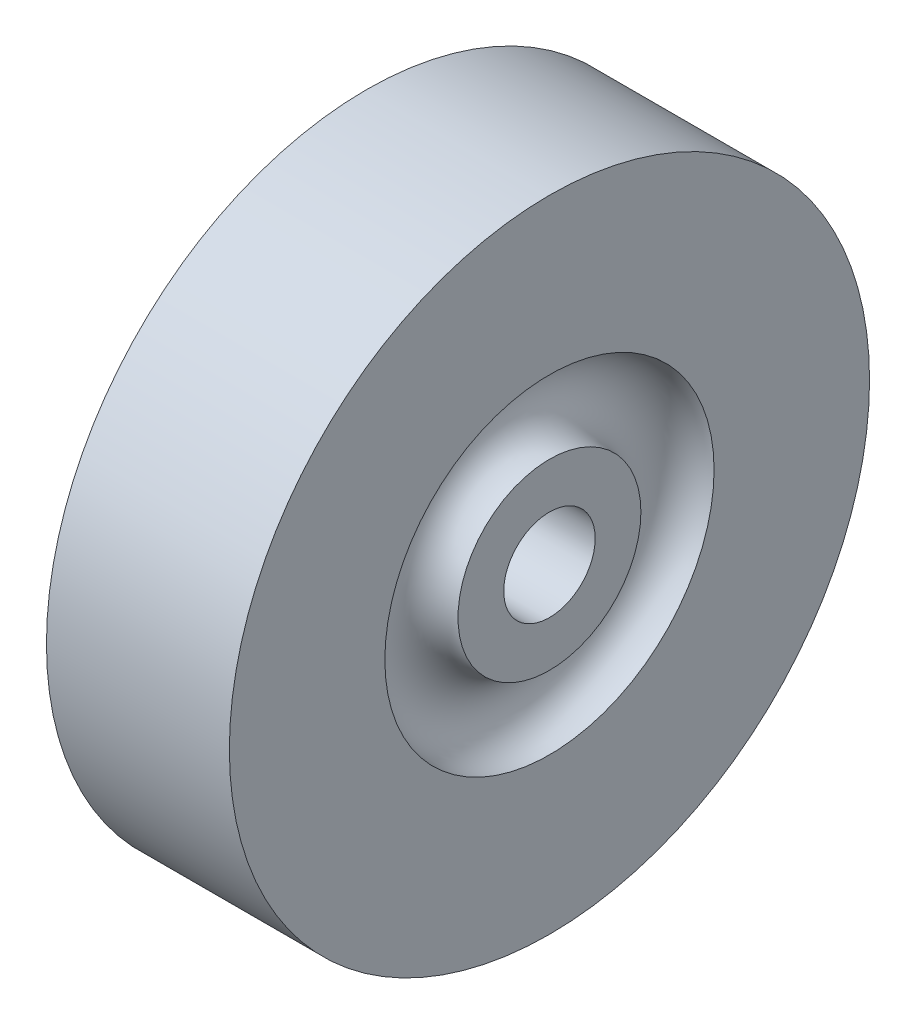
ISO-10303-21;
HEADER;
FILE_DESCRIPTION(('STEP AP214'),'2;1');
FILE_NAME('part.step','',(''),(''),'','','');
FILE_SCHEMA(('AUTOMOTIVE_DESIGN { 1 0 10303 214 1 1 1 1 }'));
ENDSEC;
DATA;
#1=APPLICATION_CONTEXT('core data for automotive mechanical design processes');
#2=APPLICATION_PROTOCOL_DEFINITION('international standard','automotive_design',2000,#1);
#3=PRODUCT_CONTEXT('',#1,'mechanical');
#4=PRODUCT('Part','Part','',(#3));
#5=PRODUCT_RELATED_PRODUCT_CATEGORY('part','',(#4));
#6=PRODUCT_DEFINITION_FORMATION('','',#4);
#7=PRODUCT_DEFINITION_CONTEXT('part definition',#1,'design');
#8=PRODUCT_DEFINITION('design','',#6,#7);
#9=PRODUCT_DEFINITION_SHAPE('','',#8);
#10=(LENGTH_UNIT() NAMED_UNIT(*) SI_UNIT(.MILLI.,.METRE.));
#11=(NAMED_UNIT(*) PLANE_ANGLE_UNIT() SI_UNIT($,.RADIAN.));
#12=(NAMED_UNIT(*) SI_UNIT($,.STERADIAN.) SOLID_ANGLE_UNIT());
#13=UNCERTAINTY_MEASURE_WITH_UNIT(LENGTH_MEASURE(1.E-05),#10,'distance_accuracy_value','');
#14=(GEOMETRIC_REPRESENTATION_CONTEXT(3) GLOBAL_UNCERTAINTY_ASSIGNED_CONTEXT((#13)) GLOBAL_UNIT_ASSIGNED_CONTEXT((#10,
#11,#12)) REPRESENTATION_CONTEXT('',''));
#15=CARTESIAN_POINT('',(0.,0.,0.));
#16=DIRECTION('',(0.,0.,1.));
#17=DIRECTION('',(1.,0.,0.));
#18=AXIS2_PLACEMENT_3D('',#15,#16,#17);
#19=CARTESIAN_POINT('',(12.7,0.,0.));
#20=DIRECTION('',(1.,0.,0.));
#21=DIRECTION('',(0.,0.,-1.));
#22=AXIS2_PLACEMENT_3D('',#19,#20,#21);
#23=TOROIDAL_SURFACE('',#22,17.78,5.08);
#24=CARTESIAN_POINT('',(12.7,0.,0.));
#25=DIRECTION('',(1.,0.,0.));
#26=DIRECTION('',(0.,0.,-1.));
#27=AXIS2_PLACEMENT_3D('',#24,#25,#26);
#28=CIRCLE('',#27,22.86);
#29=CARTESIAN_POINT('',(12.7,0.,-22.86));
#30=VERTEX_POINT('',#29);
#31=EDGE_CURVE('E62',#30,#30,#28,.T.);
#32=ORIENTED_EDGE('',*,*,#31,.T.);
#33=EDGE_LOOP('',(#32));
#34=FACE_BOUND('',#33,.T.);
#35=CARTESIAN_POINT('',(12.7,0.,0.));
#36=DIRECTION('',(1.,0.,0.));
#37=DIRECTION('',(0.,0.,-1.));
#38=AXIS2_PLACEMENT_3D('',#35,#36,#37);
#39=CIRCLE('',#38,12.7);
#40=CARTESIAN_POINT('',(12.7,0.,-12.7));
#41=VERTEX_POINT('',#40);
#42=EDGE_CURVE('E10',#41,#41,#39,.T.);
#43=ORIENTED_EDGE('',*,*,#42,.F.);
#44=EDGE_LOOP('',(#43));
#45=FACE_BOUND('',#44,.T.);
#46=ADVANCED_FACE('F34',(#34,#45),#23,.F.);
#47=CARTESIAN_POINT('',(12.7,6.35,0.));
#48=DIRECTION('',(1.,0.,0.));
#49=DIRECTION('',(0.,0.,-1.));
#50=AXIS2_PLACEMENT_3D('',#47,#48,#49);
#51=PLANE('',#50);
#52=ORIENTED_EDGE('',*,*,#42,.T.);
#53=EDGE_LOOP('',(#52));
#54=FACE_BOUND('',#53,.T.);
#55=CARTESIAN_POINT('',(12.7,0.,0.));
#56=DIRECTION('',(1.,0.,0.));
#57=DIRECTION('',(0.,0.,-1.));
#58=AXIS2_PLACEMENT_3D('',#55,#56,#57);
#59=CIRCLE('',#58,6.35);
#60=CARTESIAN_POINT('',(12.7,0.,-6.35));
#61=VERTEX_POINT('',#60);
#62=EDGE_CURVE('E40',#61,#61,#59,.T.);
#63=ORIENTED_EDGE('',*,*,#62,.F.);
#64=EDGE_LOOP('',(#63));
#65=FACE_BOUND('',#64,.T.);
#66=ADVANCED_FACE('F80',(#54,#65),#51,.T.);
#67=CARTESIAN_POINT('',(12.7,0.,0.));
#68=DIRECTION('',(1.,0.,0.));
#69=DIRECTION('',(0.,0.,-1.));
#70=AXIS2_PLACEMENT_3D('',#67,#68,#69);
#71=CYLINDRICAL_SURFACE('',#70,6.35);
#72=ORIENTED_EDGE('',*,*,#62,.T.);
#73=EDGE_LOOP('',(#72));
#74=FACE_BOUND('',#73,.T.);
#75=CARTESIAN_POINT('',(-12.7,0.,0.));
#76=DIRECTION('',(1.,0.,0.));
#77=DIRECTION('',(0.,0.,-1.));
#78=AXIS2_PLACEMENT_3D('',#75,#76,#77);
#79=CIRCLE('',#78,6.35);
#80=CARTESIAN_POINT('',(-12.7,0.,-6.35));
#81=VERTEX_POINT('',#80);
#82=EDGE_CURVE('E44',#81,#81,#79,.T.);
#83=ORIENTED_EDGE('',*,*,#82,.F.);
#84=EDGE_LOOP('',(#83));
#85=FACE_BOUND('',#84,.T.);
#86=ADVANCED_FACE('F84',(#74,#85),#71,.F.);
#87=CARTESIAN_POINT('',(-12.7,6.35,0.));
#88=DIRECTION('',(-1.,0.,0.));
#89=DIRECTION('',(0.,0.,1.));
#90=AXIS2_PLACEMENT_3D('',#87,#88,#89);
#91=PLANE('',#90);
#92=ORIENTED_EDGE('',*,*,#82,.T.);
#93=EDGE_LOOP('',(#92));
#94=FACE_BOUND('',#93,.T.);
#95=CARTESIAN_POINT('',(-12.7,0.,0.));
#96=DIRECTION('',(1.,0.,0.));
#97=DIRECTION('',(0.,0.,-1.));
#98=AXIS2_PLACEMENT_3D('',#95,#96,#97);
#99=CIRCLE('',#98,12.7);
#100=CARTESIAN_POINT('',(-12.7,0.,-12.7));
#101=VERTEX_POINT('',#100);
#102=EDGE_CURVE('E48',#101,#101,#99,.T.);
#103=ORIENTED_EDGE('',*,*,#102,.F.);
#104=EDGE_LOOP('',(#103));
#105=FACE_BOUND('',#104,.T.);
#106=ADVANCED_FACE('F88',(#94,#105),#91,.T.);
#107=CARTESIAN_POINT('',(-12.7,0.,0.));
#108=DIRECTION('',(1.,0.,0.));
#109=DIRECTION('',(0.,0.,-1.));
#110=AXIS2_PLACEMENT_3D('',#107,#108,#109);
#111=TOROIDAL_SURFACE('',#110,17.78,5.08);
#112=ORIENTED_EDGE('',*,*,#102,.T.);
#113=EDGE_LOOP('',(#112));
#114=FACE_BOUND('',#113,.T.);
#115=CARTESIAN_POINT('',(-12.7,0.,0.));
#116=DIRECTION('',(1.,0.,0.));
#117=DIRECTION('',(0.,0.,-1.));
#118=AXIS2_PLACEMENT_3D('',#115,#116,#117);
#119=CIRCLE('',#118,22.86);
#120=CARTESIAN_POINT('',(-12.7,0.,-22.86));
#121=VERTEX_POINT('',#120);
#122=EDGE_CURVE('E53',#121,#121,#119,.T.);
#123=ORIENTED_EDGE('',*,*,#122,.F.);
#124=EDGE_LOOP('',(#123));
#125=FACE_BOUND('',#124,.T.);
#126=ADVANCED_FACE('F94',(#114,#125),#111,.F.);
#127=CARTESIAN_POINT('',(-12.7,22.86,0.));
#128=DIRECTION('',(-1.,0.,0.));
#129=DIRECTION('',(0.,0.,1.));
#130=AXIS2_PLACEMENT_3D('',#127,#128,#129);
#131=PLANE('',#130);
#132=ORIENTED_EDGE('',*,*,#122,.T.);
#133=EDGE_LOOP('',(#132));
#134=FACE_BOUND('',#133,.T.);
#135=CARTESIAN_POINT('',(-12.7,0.,0.));
#136=DIRECTION('',(1.,0.,0.));
#137=DIRECTION('',(0.,0.,-1.));
#138=AXIS2_PLACEMENT_3D('',#135,#136,#137);
#139=CIRCLE('',#138,44.45);
#140=CARTESIAN_POINT('',(-12.7,0.,-44.45));
#141=VERTEX_POINT('',#140);
#142=EDGE_CURVE('E56',#141,#141,#139,.T.);
#143=ORIENTED_EDGE('',*,*,#142,.F.);
#144=EDGE_LOOP('',(#143));
#145=FACE_BOUND('',#144,.T.);
#146=ADVANCED_FACE('F76',(#134,#145),#131,.T.);
#147=CARTESIAN_POINT('',(12.7,0.,0.));
#148=DIRECTION('',(1.,0.,0.));
#149=DIRECTION('',(0.,0.,-1.));
#150=AXIS2_PLACEMENT_3D('',#147,#148,#149);
#151=CYLINDRICAL_SURFACE('',#150,44.45);
#152=ORIENTED_EDGE('',*,*,#142,.T.);
#153=EDGE_LOOP('',(#152));
#154=FACE_BOUND('',#153,.T.);
#155=CARTESIAN_POINT('',(12.7,0.,0.));
#156=DIRECTION('',(1.,0.,0.));
#157=DIRECTION('',(0.,0.,-1.));
#158=AXIS2_PLACEMENT_3D('',#155,#156,#157);
#159=CIRCLE('',#158,44.45);
#160=CARTESIAN_POINT('',(12.7,0.,-44.45));
#161=VERTEX_POINT('',#160);
#162=EDGE_CURVE('E59',#161,#161,#159,.T.);
#163=ORIENTED_EDGE('',*,*,#162,.F.);
#164=EDGE_LOOP('',(#163));
#165=FACE_BOUND('',#164,.T.);
#166=ADVANCED_FACE('F70',(#154,#165),#151,.T.);
#167=CARTESIAN_POINT('',(12.7,22.86,0.));
#168=DIRECTION('',(1.,0.,0.));
#169=DIRECTION('',(0.,0.,-1.));
#170=AXIS2_PLACEMENT_3D('',#167,#168,#169);
#171=PLANE('',#170);
#172=ORIENTED_EDGE('',*,*,#162,.T.);
#173=EDGE_LOOP('',(#172));
#174=FACE_BOUND('',#173,.T.);
#175=ORIENTED_EDGE('',*,*,#31,.F.);
#176=EDGE_LOOP('',(#175));
#177=FACE_BOUND('',#176,.T.);
#178=ADVANCED_FACE('F68',(#174,#177),#171,.T.);
#179=CLOSED_SHELL('',(#46,#66,#86,#106,#126,#146,#166,#178));
#180=MANIFOLD_SOLID_BREP('B2',#179);
#181=ADVANCED_BREP_SHAPE_REPRESENTATION('',(#18,#180),#14);
#182=SHAPE_DEFINITION_REPRESENTATION(#9,#181);
ENDSEC;
END-ISO-10303-21;
